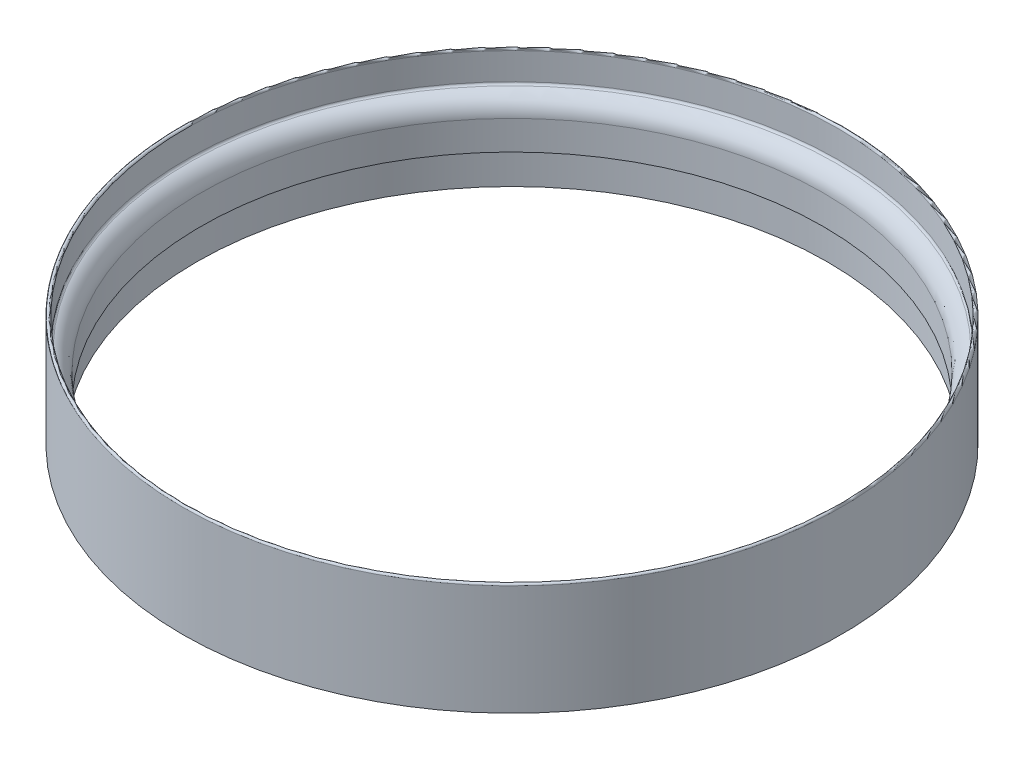
ISO-10303-21;
HEADER;
FILE_DESCRIPTION(('STEP AP214'),'2;1');
FILE_NAME('part.step','',(''),(''),'','','');
FILE_SCHEMA(('AUTOMOTIVE_DESIGN { 1 0 10303 214 1 1 1 1 }'));
ENDSEC;
DATA;
#1=APPLICATION_CONTEXT('core data for automotive mechanical design processes');
#2=APPLICATION_PROTOCOL_DEFINITION('international standard','automotive_design',2000,#1);
#3=PRODUCT_CONTEXT('',#1,'mechanical');
#4=PRODUCT('Part','Part','',(#3));
#5=PRODUCT_RELATED_PRODUCT_CATEGORY('part','',(#4));
#6=PRODUCT_DEFINITION_FORMATION('','',#4);
#7=PRODUCT_DEFINITION_CONTEXT('part definition',#1,'design');
#8=PRODUCT_DEFINITION('design','',#6,#7);
#9=PRODUCT_DEFINITION_SHAPE('','',#8);
#10=(LENGTH_UNIT() NAMED_UNIT(*) SI_UNIT(.MILLI.,.METRE.));
#11=(NAMED_UNIT(*) PLANE_ANGLE_UNIT() SI_UNIT($,.RADIAN.));
#12=(NAMED_UNIT(*) SI_UNIT($,.STERADIAN.) SOLID_ANGLE_UNIT());
#13=UNCERTAINTY_MEASURE_WITH_UNIT(LENGTH_MEASURE(1.E-05),#10,'distance_accuracy_value','');
#14=(GEOMETRIC_REPRESENTATION_CONTEXT(3) GLOBAL_UNCERTAINTY_ASSIGNED_CONTEXT((#13)) GLOBAL_UNIT_ASSIGNED_CONTEXT((#10,
#11,#12)) REPRESENTATION_CONTEXT('',''));
#15=CARTESIAN_POINT('',(0.,0.,0.));
#16=DIRECTION('',(0.,0.,1.));
#17=DIRECTION('',(1.,0.,0.));
#18=AXIS2_PLACEMENT_3D('',#15,#16,#17);
#19=CARTESIAN_POINT('',(0.,35.1062544,0.));
#20=DIRECTION('',(0.,-1.,0.));
#21=DIRECTION('',(0.,0.,-1.));
#22=AXIS2_PLACEMENT_3D('',#19,#20,#21);
#23=TOROIDAL_SURFACE('',#22,104.36225,0.539749999999999);
#24=CARTESIAN_POINT('',(0.,35.1062544,0.));
#25=DIRECTION('',(0.,-1.,0.));
#26=DIRECTION('',(0.,0.,-1.));
#27=AXIS2_PLACEMENT_3D('',#24,#25,#26);
#28=CIRCLE('',#27,104.902);
#29=CARTESIAN_POINT('',(0.,35.1062544,-104.902));
#30=VERTEX_POINT('',#29);
#31=EDGE_CURVE('E42',#30,#30,#28,.T.);
#32=ORIENTED_EDGE('',*,*,#31,.F.);
#33=EDGE_LOOP('',(#32));
#34=FACE_BOUND('',#33,.T.);
#35=CARTESIAN_POINT('',(0.,35.1062544,0.));
#36=DIRECTION('',(0.,-1.,0.));
#37=DIRECTION('',(0.,0.,-1.));
#38=AXIS2_PLACEMENT_3D('',#35,#36,#37);
#39=CIRCLE('',#38,103.8225);
#40=CARTESIAN_POINT('',(0.,35.1062544,-103.8225));
#41=VERTEX_POINT('',#40);
#42=EDGE_CURVE('E10',#41,#41,#39,.F.);
#43=ORIENTED_EDGE('',*,*,#42,.F.);
#44=EDGE_LOOP('',(#43));
#45=FACE_BOUND('',#44,.T.);
#46=ADVANCED_FACE('F34',(#34,#45),#23,.T.);
#47=CARTESIAN_POINT('',(0.,0.,0.));
#48=DIRECTION('',(0.,-1.,0.));
#49=DIRECTION('',(0.,0.,-1.));
#50=AXIS2_PLACEMENT_3D('',#47,#48,#49);
#51=CYLINDRICAL_SURFACE('',#50,104.902);
#52=ORIENTED_EDGE('',*,*,#31,.T.);
#53=EDGE_LOOP('',(#52));
#54=FACE_BOUND('',#53,.T.);
#55=CARTESIAN_POINT('',(0.,0.,0.));
#56=DIRECTION('',(0.,-1.,0.));
#57=DIRECTION('',(0.,0.,-1.));
#58=AXIS2_PLACEMENT_3D('',#55,#56,#57);
#59=CIRCLE('',#58,104.902);
#60=CARTESIAN_POINT('',(0.,0.,-104.902));
#61=VERTEX_POINT('',#60);
#62=EDGE_CURVE('E64',#61,#61,#59,.T.);
#63=ORIENTED_EDGE('',*,*,#62,.F.);
#64=EDGE_LOOP('',(#63));
#65=FACE_BOUND('',#64,.T.);
#66=ADVANCED_FACE('F97',(#54,#65),#51,.T.);
#67=CARTESIAN_POINT('',(0.,0.,104.902));
#68=DIRECTION('',(0.,1.,0.));
#69=DIRECTION('',(0.,0.,1.));
#70=AXIS2_PLACEMENT_3D('',#67,#68,#69);
#71=PLANE('',#70);
#72=CARTESIAN_POINT('',(0.,0.,0.));
#73=DIRECTION('',(0.,-1.,0.));
#74=DIRECTION('',(0.,0.,-1.));
#75=AXIS2_PLACEMENT_3D('',#72,#73,#74);
#76=CIRCLE('',#75,100.457);
#77=CARTESIAN_POINT('',(0.,0.,-100.457));
#78=VERTEX_POINT('',#77);
#79=EDGE_CURVE('E67',#78,#78,#76,.T.);
#80=ORIENTED_EDGE('',*,*,#79,.F.);
#81=EDGE_LOOP('',(#80));
#82=FACE_BOUND('',#81,.T.);
#83=ORIENTED_EDGE('',*,*,#62,.T.);
#84=EDGE_LOOP('',(#83));
#85=FACE_BOUND('',#84,.T.);
#86=ADVANCED_FACE('F93',(#82,#85),#71,.F.);
#87=CARTESIAN_POINT('',(0.,0.,0.));
#88=DIRECTION('',(0.,-1.,0.));
#89=DIRECTION('',(0.,0.,-1.));
#90=AXIS2_PLACEMENT_3D('',#87,#88,#89);
#91=CYLINDRICAL_SURFACE('',#90,100.457);
#92=CARTESIAN_POINT('',(0.,9.7062544,0.));
#93=DIRECTION('',(0.,1.,0.));
#94=DIRECTION('',(0.,0.,1.));
#95=AXIS2_PLACEMENT_3D('',#92,#93,#94);
#96=CIRCLE('',#95,100.457);
#97=CARTESIAN_POINT('',(0.,9.7062544,100.457));
#98=VERTEX_POINT('',#97);
#99=EDGE_CURVE('E47',#98,#98,#96,.T.);
#100=ORIENTED_EDGE('',*,*,#99,.T.);
#101=EDGE_LOOP('',(#100));
#102=FACE_BOUND('',#101,.T.);
#103=ORIENTED_EDGE('',*,*,#79,.T.);
#104=EDGE_LOOP('',(#103));
#105=FACE_BOUND('',#104,.T.);
#106=ADVANCED_FACE('F87',(#102,#105),#91,.F.);
#107=CARTESIAN_POINT('',(0.,10.5000044,100.457));
#108=DIRECTION('',(0.,1.,0.));
#109=DIRECTION('',(0.,0.,1.));
#110=AXIS2_PLACEMENT_3D('',#107,#108,#109);
#111=PLANE('',#110);
#112=CARTESIAN_POINT('',(0.,10.5000044,0.));
#113=DIRECTION('',(0.,1.,0.));
#114=DIRECTION('',(0.,0.,1.));
#115=AXIS2_PLACEMENT_3D('',#112,#113,#114);
#116=CIRCLE('',#115,99.66325);
#117=CARTESIAN_POINT('',(0.,10.5000044,99.66325));
#118=VERTEX_POINT('',#117);
#119=EDGE_CURVE('E52',#118,#118,#116,.F.);
#120=ORIENTED_EDGE('',*,*,#119,.T.);
#121=EDGE_LOOP('',(#120));
#122=FACE_BOUND('',#121,.T.);
#123=CARTESIAN_POINT('',(0.,10.5000044,0.));
#124=DIRECTION('',(0.,-1.,0.));
#125=DIRECTION('',(0.,0.,-1.));
#126=AXIS2_PLACEMENT_3D('',#123,#124,#125);
#127=CIRCLE('',#126,99.06);
#128=CARTESIAN_POINT('',(0.,10.5000044,-99.06));
#129=VERTEX_POINT('',#128);
#130=EDGE_CURVE('E70',#129,#129,#127,.T.);
#131=ORIENTED_EDGE('',*,*,#130,.F.);
#132=EDGE_LOOP('',(#131));
#133=FACE_BOUND('',#132,.T.);
#134=ADVANCED_FACE('F82',(#122,#133),#111,.F.);
#135=CARTESIAN_POINT('',(0.,0.,0.));
#136=DIRECTION('',(0.,-1.,0.));
#137=DIRECTION('',(0.,0.,-1.));
#138=AXIS2_PLACEMENT_3D('',#135,#136,#137);
#139=CYLINDRICAL_SURFACE('',#138,99.06);
#140=CARTESIAN_POINT('',(0.,19.7710044,0.));
#141=DIRECTION('',(0.,-1.,0.));
#142=DIRECTION('',(0.,0.,-1.));
#143=AXIS2_PLACEMENT_3D('',#140,#141,#142);
#144=CIRCLE('',#143,99.06);
#145=CARTESIAN_POINT('',(0.,19.7710044,-99.06));
#146=VERTEX_POINT('',#145);
#147=EDGE_CURVE('E73',#146,#146,#144,.T.);
#148=ORIENTED_EDGE('',*,*,#147,.F.);
#149=EDGE_LOOP('',(#148));
#150=FACE_BOUND('',#149,.T.);
#151=ORIENTED_EDGE('',*,*,#130,.T.);
#152=EDGE_LOOP('',(#151));
#153=FACE_BOUND('',#152,.T.);
#154=ADVANCED_FACE('F79',(#150,#153),#139,.F.);
#155=CARTESIAN_POINT('',(0.,19.7710044,0.));
#156=DIRECTION('',(0.,-1.,0.));
#157=DIRECTION('',(0.,0.,-1.));
#158=AXIS2_PLACEMENT_3D('',#155,#156,#157);
#159=TOROIDAL_SURFACE('',#158,105.41,6.35);
#160=CARTESIAN_POINT('',(0.,25.7578418140448,0.));
#161=DIRECTION('',(0.,-1.,0.));
#162=DIRECTION('',(0.,0.,-1.));
#163=AXIS2_PLACEMENT_3D('',#160,#161,#162);
#164=CIRCLE('',#163,103.293333333334);
#165=CARTESIAN_POINT('',(0.,25.7578418140448,-103.293333333334));
#166=VERTEX_POINT('',#165);
#167=EDGE_CURVE('E57',#166,#166,#164,.F.);
#168=ORIENTED_EDGE('',*,*,#167,.T.);
#169=EDGE_LOOP('',(#168));
#170=FACE_BOUND('',#169,.T.);
#171=ORIENTED_EDGE('',*,*,#147,.T.);
#172=EDGE_LOOP('',(#171));
#173=FACE_BOUND('',#172,.T.);
#174=ADVANCED_FACE('F77',(#170,#173),#159,.T.);
#175=CARTESIAN_POINT('',(0.,0.,0.));
#176=DIRECTION('',(0.,-1.,0.));
#177=DIRECTION('',(0.,0.,-1.));
#178=AXIS2_PLACEMENT_3D('',#175,#176,#177);
#179=CYLINDRICAL_SURFACE('',#178,103.8225);
#180=ORIENTED_EDGE('',*,*,#42,.T.);
#181=EDGE_LOOP('',(#180));
#182=FACE_BOUND('',#181,.T.);
#183=CARTESIAN_POINT('',(0.,26.5061964908019,0.));
#184=DIRECTION('',(0.,-1.,0.));
#185=DIRECTION('',(0.,0.,-1.));
#186=AXIS2_PLACEMENT_3D('',#183,#184,#185);
#187=CIRCLE('',#186,103.8225);
#188=CARTESIAN_POINT('',(0.,26.5061964908019,-103.8225));
#189=VERTEX_POINT('',#188);
#190=EDGE_CURVE('E61',#189,#189,#187,.T.);
#191=ORIENTED_EDGE('',*,*,#190,.T.);
#192=EDGE_LOOP('',(#191));
#193=FACE_BOUND('',#192,.T.);
#194=ADVANCED_FACE('F114',(#182,#193),#179,.F.);
#195=CARTESIAN_POINT('',(0.,26.5061964908019,0.));
#196=DIRECTION('',(0.,-1.,0.));
#197=DIRECTION('',(0.,0.,-1.));
#198=AXIS2_PLACEMENT_3D('',#195,#196,#197);
#199=TOROIDAL_SURFACE('',#198,103.02875,0.79375);
#200=ORIENTED_EDGE('',*,*,#167,.F.);
#201=EDGE_LOOP('',(#200));
#202=FACE_BOUND('',#201,.T.);
#203=ORIENTED_EDGE('',*,*,#190,.F.);
#204=EDGE_LOOP('',(#203));
#205=FACE_BOUND('',#204,.T.);
#206=ADVANCED_FACE('F111',(#202,#205),#199,.F.);
#207=CARTESIAN_POINT('',(0.,9.7062544,0.));
#208=DIRECTION('',(0.,1.,0.));
#209=DIRECTION('',(0.,0.,1.));
#210=AXIS2_PLACEMENT_3D('',#207,#208,#209);
#211=TOROIDAL_SURFACE('',#210,99.66325,0.79375);
#212=ORIENTED_EDGE('',*,*,#99,.F.);
#213=EDGE_LOOP('',(#212));
#214=FACE_BOUND('',#213,.T.);
#215=ORIENTED_EDGE('',*,*,#119,.F.);
#216=EDGE_LOOP('',(#215));
#217=FACE_BOUND('',#216,.T.);
#218=ADVANCED_FACE('F113',(#214,#217),#211,.F.);
#219=CLOSED_SHELL('',(#46,#66,#86,#106,#134,#154,#174,#194,#206,#218));
#220=MANIFOLD_SOLID_BREP('B2',#219);
#221=ADVANCED_BREP_SHAPE_REPRESENTATION('',(#18,#220),#14);
#222=SHAPE_DEFINITION_REPRESENTATION(#9,#221);
ENDSEC;
END-ISO-10303-21;
